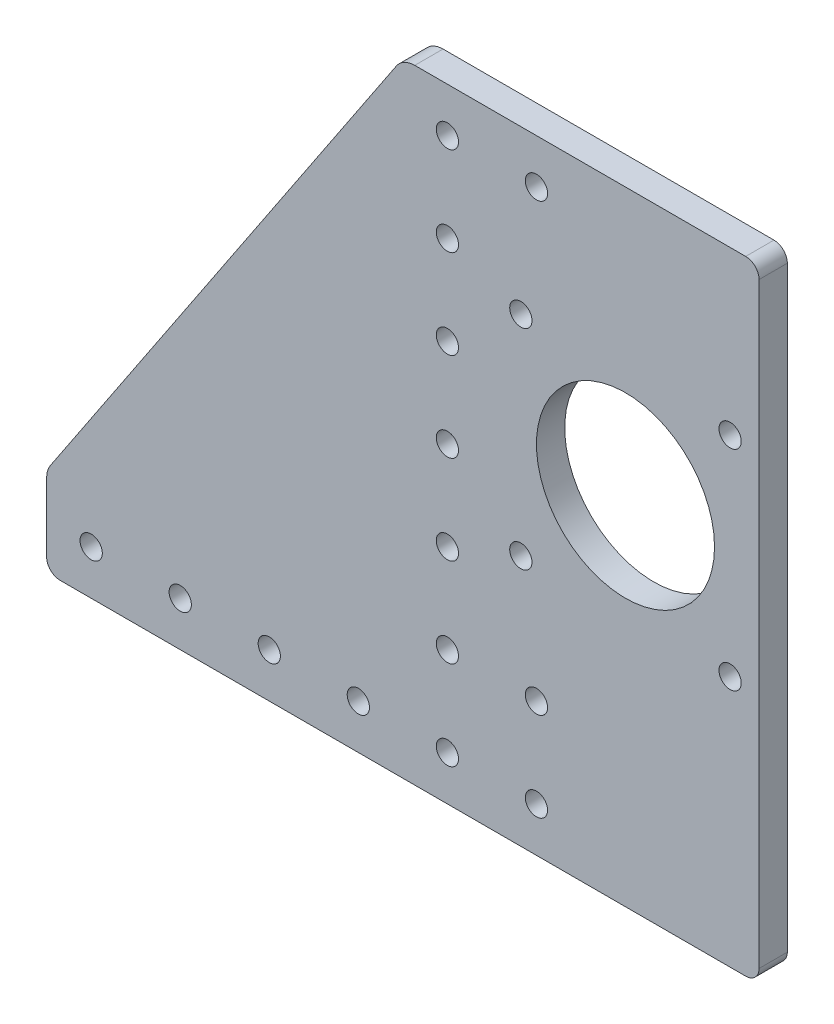
ISO-10303-21;
HEADER;
FILE_DESCRIPTION(('STEP AP214'),'2;1');
FILE_NAME('part.step','',(''),(''),'','','');
FILE_SCHEMA(('AUTOMOTIVE_DESIGN { 1 0 10303 214 1 1 1 1 }'));
ENDSEC;
DATA;
#1=APPLICATION_CONTEXT('core data for automotive mechanical design processes');
#2=APPLICATION_PROTOCOL_DEFINITION('international standard','automotive_design',2000,#1);
#3=PRODUCT_CONTEXT('',#1,'mechanical');
#4=PRODUCT('Part','Part','',(#3));
#5=PRODUCT_RELATED_PRODUCT_CATEGORY('part','',(#4));
#6=PRODUCT_DEFINITION_FORMATION('','',#4);
#7=PRODUCT_DEFINITION_CONTEXT('part definition',#1,'design');
#8=PRODUCT_DEFINITION('design','',#6,#7);
#9=PRODUCT_DEFINITION_SHAPE('','',#8);
#10=(LENGTH_UNIT() NAMED_UNIT(*) SI_UNIT(.MILLI.,.METRE.));
#11=(NAMED_UNIT(*) PLANE_ANGLE_UNIT() SI_UNIT($,.RADIAN.));
#12=(NAMED_UNIT(*) SI_UNIT($,.STERADIAN.) SOLID_ANGLE_UNIT());
#13=UNCERTAINTY_MEASURE_WITH_UNIT(LENGTH_MEASURE(1.E-05),#10,'distance_accuracy_value','');
#14=(GEOMETRIC_REPRESENTATION_CONTEXT(3) GLOBAL_UNCERTAINTY_ASSIGNED_CONTEXT((#13)) GLOBAL_UNIT_ASSIGNED_CONTEXT((#10,
#11,#12)) REPRESENTATION_CONTEXT('',''));
#15=CARTESIAN_POINT('',(0.,0.,0.));
#16=DIRECTION('',(0.,0.,1.));
#17=DIRECTION('',(1.,0.,0.));
#18=AXIS2_PLACEMENT_3D('',#15,#16,#17);
#19=CARTESIAN_POINT('',(0.,0.,6.35));
#20=DIRECTION('',(0.,0.,1.));
#21=DIRECTION('',(1.,0.,0.));
#22=AXIS2_PLACEMENT_3D('',#19,#20,#21);
#23=PLANE('',#22);
#24=CARTESIAN_POINT('',(13.5000000000004,-21.6751824817509,6.35));
#25=DIRECTION('',(0.,0.,1.));
#26=DIRECTION('',(1.,0.,0.));
#27=AXIS2_PLACEMENT_3D('',#24,#25,#26);
#28=CIRCLE('',#27,2.5);
#29=CARTESIAN_POINT('',(16.0000000000004,-21.6751824817509,6.35));
#30=VERTEX_POINT('',#29);
#31=EDGE_CURVE('E294',#30,#30,#28,.T.);
#32=ORIENTED_EDGE('',*,*,#31,.F.);
#33=EDGE_LOOP('',(#32));
#34=FACE_BOUND('',#33,.T.);
#35=CARTESIAN_POINT('',(-33.4999999999998,25.3248175182483,6.35));
#36=DIRECTION('',(0.,0.,1.));
#37=DIRECTION('',(1.,0.,0.));
#38=AXIS2_PLACEMENT_3D('',#35,#36,#37);
#39=CIRCLE('',#38,2.5);
#40=CARTESIAN_POINT('',(-30.9999999999998,25.3248175182483,6.35));
#41=VERTEX_POINT('',#40);
#42=EDGE_CURVE('E282',#41,#41,#39,.T.);
#43=ORIENTED_EDGE('',*,*,#42,.F.);
#44=EDGE_LOOP('',(#43));
#45=FACE_BOUND('',#44,.T.);
#46=CARTESIAN_POINT('',(-110.,-68.1751824817524,6.35));
#47=DIRECTION('',(0.,0.,1.));
#48=DIRECTION('',(1.,0.,0.));
#49=AXIS2_PLACEMENT_3D('',#46,#47,#48);
#50=CIRCLE('',#49,2.50000000000001);
#51=CARTESIAN_POINT('',(-107.5,-68.1751824817524,6.35));
#52=VERTEX_POINT('',#51);
#53=EDGE_CURVE('E270',#52,#52,#50,.T.);
#54=ORIENTED_EDGE('',*,*,#53,.F.);
#55=EDGE_LOOP('',(#54));
#56=FACE_BOUND('',#55,.T.);
#57=CARTESIAN_POINT('',(-70.,-68.1751824817521,6.35));
#58=DIRECTION('',(0.,0.,1.));
#59=DIRECTION('',(1.,0.,0.));
#60=AXIS2_PLACEMENT_3D('',#57,#58,#59);
#61=CIRCLE('',#60,2.50000000000002);
#62=CARTESIAN_POINT('',(-67.5,-68.1751824817521,6.35));
#63=VERTEX_POINT('',#62);
#64=EDGE_CURVE('E258',#63,#63,#61,.T.);
#65=ORIENTED_EDGE('',*,*,#64,.F.);
#66=EDGE_LOOP('',(#65));
#67=FACE_BOUND('',#66,.T.);
#68=CARTESIAN_POINT('',(-30.,-68.1751824817518,6.35));
#69=DIRECTION('',(0.,0.,1.));
#70=DIRECTION('',(1.,0.,0.));
#71=AXIS2_PLACEMENT_3D('',#68,#69,#70);
#72=CIRCLE('',#71,2.50000000000001);
#73=CARTESIAN_POINT('',(-27.5,-68.1751824817518,6.35));
#74=VERTEX_POINT('',#73);
#75=EDGE_CURVE('E246',#74,#74,#72,.T.);
#76=ORIENTED_EDGE('',*,*,#75,.F.);
#77=EDGE_LOOP('',(#76));
#78=FACE_BOUND('',#77,.T.);
#79=CARTESIAN_POINT('',(-30.0000000000003,51.8248175182482,6.35));
#80=DIRECTION('',(0.,0.,1.));
#81=DIRECTION('',(1.,0.,0.));
#82=AXIS2_PLACEMENT_3D('',#79,#80,#81);
#83=CIRCLE('',#82,2.5);
#84=CARTESIAN_POINT('',(-27.5000000000003,51.8248175182482,6.35));
#85=VERTEX_POINT('',#84);
#86=EDGE_CURVE('E234',#85,#85,#83,.T.);
#87=ORIENTED_EDGE('',*,*,#86,.F.);
#88=EDGE_LOOP('',(#87));
#89=FACE_BOUND('',#88,.T.);
#90=CARTESIAN_POINT('',(-50.0000000000003,51.8248175182482,6.35));
#91=DIRECTION('',(0.,0.,1.));
#92=DIRECTION('',(1.,0.,0.));
#93=AXIS2_PLACEMENT_3D('',#90,#91,#92);
#94=CIRCLE('',#93,2.5);
#95=CARTESIAN_POINT('',(-47.5000000000003,51.8248175182482,6.35));
#96=VERTEX_POINT('',#95);
#97=EDGE_CURVE('E222',#96,#96,#94,.T.);
#98=ORIENTED_EDGE('',*,*,#97,.F.);
#99=EDGE_LOOP('',(#98));
#100=FACE_BOUND('',#99,.T.);
#101=CARTESIAN_POINT('',(-50.0000000000002,11.8248175182482,6.35));
#102=DIRECTION('',(0.,0.,1.));
#103=DIRECTION('',(1.,0.,0.));
#104=AXIS2_PLACEMENT_3D('',#101,#102,#103);
#105=CIRCLE('',#104,2.5);
#106=CARTESIAN_POINT('',(-47.5000000000002,11.8248175182482,6.35));
#107=VERTEX_POINT('',#106);
#108=EDGE_CURVE('E210',#107,#107,#105,.T.);
#109=ORIENTED_EDGE('',*,*,#108,.F.);
#110=EDGE_LOOP('',(#109));
#111=FACE_BOUND('',#110,.T.);
#112=CARTESIAN_POINT('',(-50.,-28.1751824817518,6.35));
#113=DIRECTION('',(0.,0.,1.));
#114=DIRECTION('',(1.,0.,0.));
#115=AXIS2_PLACEMENT_3D('',#112,#113,#114);
#116=CIRCLE('',#115,2.5);
#117=CARTESIAN_POINT('',(-47.5,-28.1751824817518,6.35));
#118=VERTEX_POINT('',#117);
#119=EDGE_CURVE('E198',#118,#118,#116,.T.);
#120=ORIENTED_EDGE('',*,*,#119,.F.);
#121=EDGE_LOOP('',(#120));
#122=FACE_BOUND('',#121,.T.);
#123=DIRECTION('',(1.,0.,0.));
#124=VECTOR('',#123,1.);
#125=CARTESIAN_POINT('',(-140.,-78.1751824817518,6.35));
#126=LINE('',#125,#124);
#127=CARTESIAN_POINT('',(-137.,-78.1751824817518,6.35));
#128=VERTEX_POINT('',#127);
#129=CARTESIAN_POINT('',(17.,-78.1751824817518,6.35));
#130=VERTEX_POINT('',#129);
#131=EDGE_CURVE('E126',#128,#130,#126,.T.);
#132=ORIENTED_EDGE('',*,*,#131,.T.);
#133=CARTESIAN_POINT('',(17.,-75.1751824817518,6.35));
#134=DIRECTION('',(0.,0.,1.));
#135=DIRECTION('',(1.,0.,0.));
#136=AXIS2_PLACEMENT_3D('',#133,#134,#135);
#137=CIRCLE('',#136,3.);
#138=CARTESIAN_POINT('',(20.,-75.1751824817518,6.35));
#139=VERTEX_POINT('',#138);
#140=EDGE_CURVE('E173',#130,#139,#137,.T.);
#141=ORIENTED_EDGE('',*,*,#140,.T.);
#142=DIRECTION('',(0.,1.,0.));
#143=VECTOR('',#142,1.);
#144=CARTESIAN_POINT('',(20.,-78.1751824817518,6.35));
#145=LINE('',#144,#143);
#146=CARTESIAN_POINT('',(20.,58.8248175182482,6.35));
#147=VERTEX_POINT('',#146);
#148=EDGE_CURVE('E137',#139,#147,#145,.T.);
#149=ORIENTED_EDGE('',*,*,#148,.T.);
#150=CARTESIAN_POINT('',(17.,58.8248175182482,6.35));
#151=DIRECTION('',(0.,0.,1.));
#152=DIRECTION('',(1.,0.,0.));
#153=AXIS2_PLACEMENT_3D('',#150,#151,#152);
#154=CIRCLE('',#153,3.);
#155=CARTESIAN_POINT('',(17.,61.8248175182482,6.35));
#156=VERTEX_POINT('',#155);
#157=EDGE_CURVE('E47',#147,#156,#154,.T.);
#158=ORIENTED_EDGE('',*,*,#157,.T.);
#159=DIRECTION('',(-1.,0.,0.));
#160=VECTOR('',#159,1.);
#161=CARTESIAN_POINT('',(20.,61.8248175182482,6.35));
#162=LINE('',#161,#160);
#163=CARTESIAN_POINT('',(-57.32408120756,61.8248175182482,6.35));
#164=VERTEX_POINT('',#163);
#165=EDGE_CURVE('E179',#156,#164,#162,.T.);
#166=ORIENTED_EDGE('',*,*,#165,.T.);
#167=CARTESIAN_POINT('',(-57.32408120756,56.8248175182482,6.35));
#168=DIRECTION('',(0.,0.,1.));
#169=DIRECTION('',(1.,0.,0.));
#170=AXIS2_PLACEMENT_3D('',#167,#168,#169);
#171=CIRCLE('',#170,5.);
#172=CARTESIAN_POINT('',(-61.4843326792492,59.5983184993743,6.35));
#173=VERTEX_POINT('',#172);
#174=EDGE_CURVE('E148',#164,#173,#171,.T.);
#175=ORIENTED_EDGE('',*,*,#174,.T.);
#176=DIRECTION('',(-0.554700196225227,-0.832050294337845,0.));
#177=VECTOR('',#176,1.);
#178=CARTESIAN_POINT('',(-140.,-58.1751824817518,6.35));
#179=LINE('',#178,#177);
#180=CARTESIAN_POINT('',(-139.160251471689,-56.9155596892856,6.35));
#181=VERTEX_POINT('',#180);
#182=EDGE_CURVE('E190',#173,#181,#179,.T.);
#183=ORIENTED_EDGE('',*,*,#182,.T.);
#184=CARTESIAN_POINT('',(-135.,-59.6890606704118,6.35));
#185=DIRECTION('',(0.,0.,1.));
#186=DIRECTION('',(1.,0.,0.));
#187=AXIS2_PLACEMENT_3D('',#184,#185,#186);
#188=CIRCLE('',#187,5.);
#189=CARTESIAN_POINT('',(-140.,-59.6890606704118,6.35));
#190=VERTEX_POINT('',#189);
#191=EDGE_CURVE('E150',#181,#190,#188,.T.);
#192=ORIENTED_EDGE('',*,*,#191,.T.);
#193=DIRECTION('',(0.,-1.,0.));
#194=VECTOR('',#193,1.);
#195=CARTESIAN_POINT('',(-140.,-78.1751824817518,6.35));
#196=LINE('',#195,#194);
#197=CARTESIAN_POINT('',(-140.,-75.1751824817518,6.35));
#198=VERTEX_POINT('',#197);
#199=EDGE_CURVE('E125',#190,#198,#196,.T.);
#200=ORIENTED_EDGE('',*,*,#199,.T.);
#201=CARTESIAN_POINT('',(-137.,-75.1751824817518,6.35));
#202=DIRECTION('',(0.,0.,1.));
#203=DIRECTION('',(1.,0.,0.));
#204=AXIS2_PLACEMENT_3D('',#201,#202,#203);
#205=CIRCLE('',#204,3.);
#206=EDGE_CURVE('E170',#198,#128,#205,.T.);
#207=ORIENTED_EDGE('',*,*,#206,.T.);
#208=EDGE_LOOP('',(#132,#141,#149,#158,#166,#175,#183,#192,#200,#207));
#209=FACE_BOUND('',#208,.T.);
#210=CARTESIAN_POINT('',(-50.,-48.1751824817518,6.35));
#211=DIRECTION('',(0.,0.,1.));
#212=DIRECTION('',(1.,0.,0.));
#213=AXIS2_PLACEMENT_3D('',#210,#211,#212);
#214=CIRCLE('',#213,2.5);
#215=CARTESIAN_POINT('',(-47.5,-48.1751824817518,6.35));
#216=VERTEX_POINT('',#215);
#217=EDGE_CURVE('E184',#216,#216,#214,.T.);
#218=ORIENTED_EDGE('',*,*,#217,.F.);
#219=EDGE_LOOP('',(#218));
#220=FACE_BOUND('',#219,.T.);
#221=CARTESIAN_POINT('',(-50.0000000000001,-8.17518248175182,6.35));
#222=DIRECTION('',(0.,0.,1.));
#223=DIRECTION('',(1.,0.,0.));
#224=AXIS2_PLACEMENT_3D('',#221,#222,#223);
#225=CIRCLE('',#224,2.5);
#226=CARTESIAN_POINT('',(-47.5000000000001,-8.17518248175182,6.35));
#227=VERTEX_POINT('',#226);
#228=EDGE_CURVE('E204',#227,#227,#225,.T.);
#229=ORIENTED_EDGE('',*,*,#228,.F.);
#230=EDGE_LOOP('',(#229));
#231=FACE_BOUND('',#230,.T.);
#232=CARTESIAN_POINT('',(-50.0000000000003,31.8248175182482,6.35));
#233=DIRECTION('',(0.,0.,1.));
#234=DIRECTION('',(1.,0.,0.));
#235=AXIS2_PLACEMENT_3D('',#232,#233,#234);
#236=CIRCLE('',#235,2.5);
#237=CARTESIAN_POINT('',(-47.5000000000002,31.8248175182482,6.35));
#238=VERTEX_POINT('',#237);
#239=EDGE_CURVE('E216',#238,#238,#236,.T.);
#240=ORIENTED_EDGE('',*,*,#239,.F.);
#241=EDGE_LOOP('',(#240));
#242=FACE_BOUND('',#241,.T.);
#243=CARTESIAN_POINT('',(-30.,-48.1751824817518,6.35));
#244=DIRECTION('',(0.,0.,1.));
#245=DIRECTION('',(1.,0.,0.));
#246=AXIS2_PLACEMENT_3D('',#243,#244,#245);
#247=CIRCLE('',#246,2.5);
#248=CARTESIAN_POINT('',(-27.5,-48.1751824817518,6.35));
#249=VERTEX_POINT('',#248);
#250=EDGE_CURVE('E228',#249,#249,#247,.T.);
#251=ORIENTED_EDGE('',*,*,#250,.F.);
#252=EDGE_LOOP('',(#251));
#253=FACE_BOUND('',#252,.T.);
#254=CARTESIAN_POINT('',(-9.99999999999993,1.82481751824846,6.35));
#255=DIRECTION('',(0.,0.,1.));
#256=DIRECTION('',(1.,0.,0.));
#257=AXIS2_PLACEMENT_3D('',#254,#255,#256);
#258=CIRCLE('',#257,20.);
#259=CARTESIAN_POINT('',(10.0000000000001,1.82481751824846,6.35));
#260=VERTEX_POINT('',#259);
#261=EDGE_CURVE('E240',#260,#260,#258,.T.);
#262=ORIENTED_EDGE('',*,*,#261,.F.);
#263=EDGE_LOOP('',(#262));
#264=FACE_BOUND('',#263,.T.);
#265=CARTESIAN_POINT('',(-50.,-68.1751824817519,6.35));
#266=DIRECTION('',(0.,0.,1.));
#267=DIRECTION('',(1.,0.,0.));
#268=AXIS2_PLACEMENT_3D('',#265,#266,#267);
#269=CIRCLE('',#268,2.50000000000001);
#270=CARTESIAN_POINT('',(-47.5,-68.1751824817519,6.35));
#271=VERTEX_POINT('',#270);
#272=EDGE_CURVE('E252',#271,#271,#269,.T.);
#273=ORIENTED_EDGE('',*,*,#272,.F.);
#274=EDGE_LOOP('',(#273));
#275=FACE_BOUND('',#274,.T.);
#276=CARTESIAN_POINT('',(-90.,-68.1751824817522,6.35));
#277=DIRECTION('',(0.,0.,1.));
#278=DIRECTION('',(1.,0.,0.));
#279=AXIS2_PLACEMENT_3D('',#276,#277,#278);
#280=CIRCLE('',#279,2.50000000000001);
#281=CARTESIAN_POINT('',(-87.5,-68.1751824817522,6.35));
#282=VERTEX_POINT('',#281);
#283=EDGE_CURVE('E264',#282,#282,#280,.T.);
#284=ORIENTED_EDGE('',*,*,#283,.F.);
#285=EDGE_LOOP('',(#284));
#286=FACE_BOUND('',#285,.T.);
#287=CARTESIAN_POINT('',(-130.,-68.1751824817525,6.35));
#288=DIRECTION('',(0.,0.,1.));
#289=DIRECTION('',(1.,0.,0.));
#290=AXIS2_PLACEMENT_3D('',#287,#288,#289);
#291=CIRCLE('',#290,2.5);
#292=CARTESIAN_POINT('',(-127.5,-68.1751824817525,6.35));
#293=VERTEX_POINT('',#292);
#294=EDGE_CURVE('E276',#293,#293,#291,.T.);
#295=ORIENTED_EDGE('',*,*,#294,.F.);
#296=EDGE_LOOP('',(#295));
#297=FACE_BOUND('',#296,.T.);
#298=CARTESIAN_POINT('',(13.5,25.3248175182489,6.35));
#299=DIRECTION('',(0.,0.,1.));
#300=DIRECTION('',(1.,0.,0.));
#301=AXIS2_PLACEMENT_3D('',#298,#299,#300);
#302=CIRCLE('',#301,2.5);
#303=CARTESIAN_POINT('',(16.,25.3248175182489,6.35));
#304=VERTEX_POINT('',#303);
#305=EDGE_CURVE('E288',#304,#304,#302,.T.);
#306=ORIENTED_EDGE('',*,*,#305,.F.);
#307=EDGE_LOOP('',(#306));
#308=FACE_BOUND('',#307,.T.);
#309=CARTESIAN_POINT('',(-33.4999999999994,-21.6751824817511,6.35));
#310=DIRECTION('',(0.,0.,1.));
#311=DIRECTION('',(1.,0.,0.));
#312=AXIS2_PLACEMENT_3D('',#309,#310,#311);
#313=CIRCLE('',#312,2.5);
#314=CARTESIAN_POINT('',(-30.9999999999994,-21.6751824817511,6.35));
#315=VERTEX_POINT('',#314);
#316=EDGE_CURVE('E300',#315,#315,#313,.T.);
#317=ORIENTED_EDGE('',*,*,#316,.F.);
#318=EDGE_LOOP('',(#317));
#319=FACE_BOUND('',#318,.T.);
#320=ADVANCED_FACE('F32',(#34,#45,#56,#67,#78,#89,#100,#111,#122,#209,#220,#231,#242,#253,#264,
#275,#286,#297,#308,#319),#23,.T.);
#321=CARTESIAN_POINT('',(0.,0.,0.));
#322=DIRECTION('',(0.,0.,1.));
#323=DIRECTION('',(1.,0.,0.));
#324=AXIS2_PLACEMENT_3D('',#321,#322,#323);
#325=PLANE('',#324);
#326=DIRECTION('',(0.,1.,0.));
#327=VECTOR('',#326,1.);
#328=CARTESIAN_POINT('',(20.,-78.1751824817518,0.));
#329=LINE('',#328,#327);
#330=CARTESIAN_POINT('',(20.,-75.1751824817518,0.));
#331=VERTEX_POINT('',#330);
#332=CARTESIAN_POINT('',(20.,58.8248175182482,0.));
#333=VERTEX_POINT('',#332);
#334=EDGE_CURVE('E183',#331,#333,#329,.T.);
#335=ORIENTED_EDGE('',*,*,#334,.F.);
#336=CARTESIAN_POINT('',(17.,-75.1751824817518,0.));
#337=DIRECTION('',(0.,0.,1.));
#338=DIRECTION('',(1.,0.,0.));
#339=AXIS2_PLACEMENT_3D('',#336,#337,#338);
#340=CIRCLE('',#339,3.);
#341=CARTESIAN_POINT('',(17.,-78.1751824817518,0.));
#342=VERTEX_POINT('',#341);
#343=EDGE_CURVE('E163',#331,#342,#340,.F.);
#344=ORIENTED_EDGE('',*,*,#343,.T.);
#345=DIRECTION('',(1.,0.,0.));
#346=VECTOR('',#345,1.);
#347=CARTESIAN_POINT('',(-140.,-78.1751824817518,0.));
#348=LINE('',#347,#346);
#349=CARTESIAN_POINT('',(-137.,-78.1751824817518,0.));
#350=VERTEX_POINT('',#349);
#351=EDGE_CURVE('E133',#350,#342,#348,.T.);
#352=ORIENTED_EDGE('',*,*,#351,.F.);
#353=CARTESIAN_POINT('',(-137.,-75.1751824817518,0.));
#354=DIRECTION('',(0.,0.,1.));
#355=DIRECTION('',(1.,0.,0.));
#356=AXIS2_PLACEMENT_3D('',#353,#354,#355);
#357=CIRCLE('',#356,3.);
#358=CARTESIAN_POINT('',(-140.,-75.1751824817518,0.));
#359=VERTEX_POINT('',#358);
#360=EDGE_CURVE('E132',#350,#359,#357,.F.);
#361=ORIENTED_EDGE('',*,*,#360,.T.);
#362=DIRECTION('',(0.,-1.,0.));
#363=VECTOR('',#362,1.);
#364=CARTESIAN_POINT('',(-140.,-78.1751824817518,0.));
#365=LINE('',#364,#363);
#366=CARTESIAN_POINT('',(-140.,-59.6890606704118,0.));
#367=VERTEX_POINT('',#366);
#368=EDGE_CURVE('E124',#367,#359,#365,.T.);
#369=ORIENTED_EDGE('',*,*,#368,.F.);
#370=CARTESIAN_POINT('',(-135.,-59.6890606704118,0.));
#371=DIRECTION('',(0.,0.,1.));
#372=DIRECTION('',(1.,0.,0.));
#373=AXIS2_PLACEMENT_3D('',#370,#371,#372);
#374=CIRCLE('',#373,5.);
#375=CARTESIAN_POINT('',(-139.160251471689,-56.9155596892856,0.));
#376=VERTEX_POINT('',#375);
#377=EDGE_CURVE('E110',#367,#376,#374,.F.);
#378=ORIENTED_EDGE('',*,*,#377,.T.);
#379=DIRECTION('',(-0.554700196225227,-0.832050294337845,0.));
#380=VECTOR('',#379,1.);
#381=CARTESIAN_POINT('',(-140.,-58.1751824817518,0.));
#382=LINE('',#381,#380);
#383=CARTESIAN_POINT('',(-61.4843326792492,59.5983184993743,0.));
#384=VERTEX_POINT('',#383);
#385=EDGE_CURVE('E134',#384,#376,#382,.T.);
#386=ORIENTED_EDGE('',*,*,#385,.F.);
#387=CARTESIAN_POINT('',(-57.32408120756,56.8248175182482,0.));
#388=DIRECTION('',(0.,0.,1.));
#389=DIRECTION('',(1.,0.,0.));
#390=AXIS2_PLACEMENT_3D('',#387,#388,#389);
#391=CIRCLE('',#390,5.);
#392=CARTESIAN_POINT('',(-57.32408120756,61.8248175182482,0.));
#393=VERTEX_POINT('',#392);
#394=EDGE_CURVE('E121',#384,#393,#391,.F.);
#395=ORIENTED_EDGE('',*,*,#394,.T.);
#396=DIRECTION('',(-1.,0.,0.));
#397=VECTOR('',#396,1.);
#398=CARTESIAN_POINT('',(20.,61.8248175182482,0.));
#399=LINE('',#398,#397);
#400=CARTESIAN_POINT('',(17.,61.8248175182482,0.));
#401=VERTEX_POINT('',#400);
#402=EDGE_CURVE('E139',#401,#393,#399,.T.);
#403=ORIENTED_EDGE('',*,*,#402,.F.);
#404=CARTESIAN_POINT('',(17.,58.8248175182482,0.));
#405=DIRECTION('',(0.,0.,1.));
#406=DIRECTION('',(1.,0.,0.));
#407=AXIS2_PLACEMENT_3D('',#404,#405,#406);
#408=CIRCLE('',#407,3.);
#409=EDGE_CURVE('E161',#401,#333,#408,.F.);
#410=ORIENTED_EDGE('',*,*,#409,.T.);
#411=EDGE_LOOP('',(#335,#344,#352,#361,#369,#378,#386,#395,#403,#410));
#412=FACE_BOUND('',#411,.T.);
#413=CARTESIAN_POINT('',(-50.,-48.1751824817518,0.));
#414=DIRECTION('',(0.,0.,1.));
#415=DIRECTION('',(1.,0.,0.));
#416=AXIS2_PLACEMENT_3D('',#413,#414,#415);
#417=CIRCLE('',#416,2.5);
#418=CARTESIAN_POINT('',(-47.5,-48.1751824817518,0.));
#419=VERTEX_POINT('',#418);
#420=EDGE_CURVE('E195',#419,#419,#417,.T.);
#421=ORIENTED_EDGE('',*,*,#420,.T.);
#422=EDGE_LOOP('',(#421));
#423=FACE_BOUND('',#422,.T.);
#424=CARTESIAN_POINT('',(-50.,-28.1751824817518,0.));
#425=DIRECTION('',(0.,0.,1.));
#426=DIRECTION('',(1.,0.,0.));
#427=AXIS2_PLACEMENT_3D('',#424,#425,#426);
#428=CIRCLE('',#427,2.5);
#429=CARTESIAN_POINT('',(-47.5,-28.1751824817518,0.));
#430=VERTEX_POINT('',#429);
#431=EDGE_CURVE('E201',#430,#430,#428,.T.);
#432=ORIENTED_EDGE('',*,*,#431,.T.);
#433=EDGE_LOOP('',(#432));
#434=FACE_BOUND('',#433,.T.);
#435=CARTESIAN_POINT('',(-50.0000000000001,-8.17518248175182,0.));
#436=DIRECTION('',(0.,0.,1.));
#437=DIRECTION('',(1.,0.,0.));
#438=AXIS2_PLACEMENT_3D('',#435,#436,#437);
#439=CIRCLE('',#438,2.5);
#440=CARTESIAN_POINT('',(-47.5000000000001,-8.17518248175182,0.));
#441=VERTEX_POINT('',#440);
#442=EDGE_CURVE('E207',#441,#441,#439,.T.);
#443=ORIENTED_EDGE('',*,*,#442,.T.);
#444=EDGE_LOOP('',(#443));
#445=FACE_BOUND('',#444,.T.);
#446=CARTESIAN_POINT('',(-50.0000000000002,11.8248175182482,0.));
#447=DIRECTION('',(0.,0.,1.));
#448=DIRECTION('',(1.,0.,0.));
#449=AXIS2_PLACEMENT_3D('',#446,#447,#448);
#450=CIRCLE('',#449,2.5);
#451=CARTESIAN_POINT('',(-47.5000000000002,11.8248175182482,0.));
#452=VERTEX_POINT('',#451);
#453=EDGE_CURVE('E213',#452,#452,#450,.T.);
#454=ORIENTED_EDGE('',*,*,#453,.T.);
#455=EDGE_LOOP('',(#454));
#456=FACE_BOUND('',#455,.T.);
#457=CARTESIAN_POINT('',(-50.0000000000003,31.8248175182482,0.));
#458=DIRECTION('',(0.,0.,1.));
#459=DIRECTION('',(1.,0.,0.));
#460=AXIS2_PLACEMENT_3D('',#457,#458,#459);
#461=CIRCLE('',#460,2.5);
#462=CARTESIAN_POINT('',(-47.5000000000002,31.8248175182482,0.));
#463=VERTEX_POINT('',#462);
#464=EDGE_CURVE('E219',#463,#463,#461,.T.);
#465=ORIENTED_EDGE('',*,*,#464,.T.);
#466=EDGE_LOOP('',(#465));
#467=FACE_BOUND('',#466,.T.);
#468=CARTESIAN_POINT('',(-50.0000000000003,51.8248175182482,0.));
#469=DIRECTION('',(0.,0.,1.));
#470=DIRECTION('',(1.,0.,0.));
#471=AXIS2_PLACEMENT_3D('',#468,#469,#470);
#472=CIRCLE('',#471,2.5);
#473=CARTESIAN_POINT('',(-47.5000000000003,51.8248175182482,0.));
#474=VERTEX_POINT('',#473);
#475=EDGE_CURVE('E225',#474,#474,#472,.T.);
#476=ORIENTED_EDGE('',*,*,#475,.T.);
#477=EDGE_LOOP('',(#476));
#478=FACE_BOUND('',#477,.T.);
#479=CARTESIAN_POINT('',(-30.,-48.1751824817518,0.));
#480=DIRECTION('',(0.,0.,1.));
#481=DIRECTION('',(1.,0.,0.));
#482=AXIS2_PLACEMENT_3D('',#479,#480,#481);
#483=CIRCLE('',#482,2.5);
#484=CARTESIAN_POINT('',(-27.5,-48.1751824817518,0.));
#485=VERTEX_POINT('',#484);
#486=EDGE_CURVE('E231',#485,#485,#483,.T.);
#487=ORIENTED_EDGE('',*,*,#486,.T.);
#488=EDGE_LOOP('',(#487));
#489=FACE_BOUND('',#488,.T.);
#490=CARTESIAN_POINT('',(-30.0000000000003,51.8248175182482,0.));
#491=DIRECTION('',(0.,0.,1.));
#492=DIRECTION('',(1.,0.,0.));
#493=AXIS2_PLACEMENT_3D('',#490,#491,#492);
#494=CIRCLE('',#493,2.5);
#495=CARTESIAN_POINT('',(-27.5000000000003,51.8248175182482,0.));
#496=VERTEX_POINT('',#495);
#497=EDGE_CURVE('E237',#496,#496,#494,.T.);
#498=ORIENTED_EDGE('',*,*,#497,.T.);
#499=EDGE_LOOP('',(#498));
#500=FACE_BOUND('',#499,.T.);
#501=CARTESIAN_POINT('',(-9.99999999999993,1.82481751824846,0.));
#502=DIRECTION('',(0.,0.,1.));
#503=DIRECTION('',(1.,0.,0.));
#504=AXIS2_PLACEMENT_3D('',#501,#502,#503);
#505=CIRCLE('',#504,20.);
#506=CARTESIAN_POINT('',(10.0000000000001,1.82481751824846,0.));
#507=VERTEX_POINT('',#506);
#508=EDGE_CURVE('E243',#507,#507,#505,.T.);
#509=ORIENTED_EDGE('',*,*,#508,.T.);
#510=EDGE_LOOP('',(#509));
#511=FACE_BOUND('',#510,.T.);
#512=CARTESIAN_POINT('',(-30.,-68.1751824817518,0.));
#513=DIRECTION('',(0.,0.,1.));
#514=DIRECTION('',(1.,0.,0.));
#515=AXIS2_PLACEMENT_3D('',#512,#513,#514);
#516=CIRCLE('',#515,2.50000000000001);
#517=CARTESIAN_POINT('',(-27.5,-68.1751824817518,0.));
#518=VERTEX_POINT('',#517);
#519=EDGE_CURVE('E249',#518,#518,#516,.T.);
#520=ORIENTED_EDGE('',*,*,#519,.T.);
#521=EDGE_LOOP('',(#520));
#522=FACE_BOUND('',#521,.T.);
#523=CARTESIAN_POINT('',(-50.,-68.1751824817519,0.));
#524=DIRECTION('',(0.,0.,1.));
#525=DIRECTION('',(1.,0.,0.));
#526=AXIS2_PLACEMENT_3D('',#523,#524,#525);
#527=CIRCLE('',#526,2.50000000000001);
#528=CARTESIAN_POINT('',(-47.5,-68.1751824817519,0.));
#529=VERTEX_POINT('',#528);
#530=EDGE_CURVE('E255',#529,#529,#527,.T.);
#531=ORIENTED_EDGE('',*,*,#530,.T.);
#532=EDGE_LOOP('',(#531));
#533=FACE_BOUND('',#532,.T.);
#534=CARTESIAN_POINT('',(-70.,-68.1751824817521,0.));
#535=DIRECTION('',(0.,0.,1.));
#536=DIRECTION('',(1.,0.,0.));
#537=AXIS2_PLACEMENT_3D('',#534,#535,#536);
#538=CIRCLE('',#537,2.50000000000002);
#539=CARTESIAN_POINT('',(-67.5,-68.1751824817521,0.));
#540=VERTEX_POINT('',#539);
#541=EDGE_CURVE('E261',#540,#540,#538,.T.);
#542=ORIENTED_EDGE('',*,*,#541,.T.);
#543=EDGE_LOOP('',(#542));
#544=FACE_BOUND('',#543,.T.);
#545=CARTESIAN_POINT('',(-90.,-68.1751824817522,0.));
#546=DIRECTION('',(0.,0.,1.));
#547=DIRECTION('',(1.,0.,0.));
#548=AXIS2_PLACEMENT_3D('',#545,#546,#547);
#549=CIRCLE('',#548,2.50000000000001);
#550=CARTESIAN_POINT('',(-87.5,-68.1751824817522,0.));
#551=VERTEX_POINT('',#550);
#552=EDGE_CURVE('E267',#551,#551,#549,.T.);
#553=ORIENTED_EDGE('',*,*,#552,.T.);
#554=EDGE_LOOP('',(#553));
#555=FACE_BOUND('',#554,.T.);
#556=CARTESIAN_POINT('',(-110.,-68.1751824817524,0.));
#557=DIRECTION('',(0.,0.,1.));
#558=DIRECTION('',(1.,0.,0.));
#559=AXIS2_PLACEMENT_3D('',#556,#557,#558);
#560=CIRCLE('',#559,2.50000000000001);
#561=CARTESIAN_POINT('',(-107.5,-68.1751824817524,0.));
#562=VERTEX_POINT('',#561);
#563=EDGE_CURVE('E273',#562,#562,#560,.T.);
#564=ORIENTED_EDGE('',*,*,#563,.T.);
#565=EDGE_LOOP('',(#564));
#566=FACE_BOUND('',#565,.T.);
#567=CARTESIAN_POINT('',(-130.,-68.1751824817525,0.));
#568=DIRECTION('',(0.,0.,1.));
#569=DIRECTION('',(1.,0.,0.));
#570=AXIS2_PLACEMENT_3D('',#567,#568,#569);
#571=CIRCLE('',#570,2.5);
#572=CARTESIAN_POINT('',(-127.5,-68.1751824817525,0.));
#573=VERTEX_POINT('',#572);
#574=EDGE_CURVE('E279',#573,#573,#571,.T.);
#575=ORIENTED_EDGE('',*,*,#574,.T.);
#576=EDGE_LOOP('',(#575));
#577=FACE_BOUND('',#576,.T.);
#578=CARTESIAN_POINT('',(-33.4999999999998,25.3248175182483,0.));
#579=DIRECTION('',(0.,0.,1.));
#580=DIRECTION('',(1.,0.,0.));
#581=AXIS2_PLACEMENT_3D('',#578,#579,#580);
#582=CIRCLE('',#581,2.5);
#583=CARTESIAN_POINT('',(-30.9999999999998,25.3248175182483,0.));
#584=VERTEX_POINT('',#583);
#585=EDGE_CURVE('E285',#584,#584,#582,.T.);
#586=ORIENTED_EDGE('',*,*,#585,.T.);
#587=EDGE_LOOP('',(#586));
#588=FACE_BOUND('',#587,.T.);
#589=CARTESIAN_POINT('',(13.5,25.3248175182489,0.));
#590=DIRECTION('',(0.,0.,1.));
#591=DIRECTION('',(1.,0.,0.));
#592=AXIS2_PLACEMENT_3D('',#589,#590,#591);
#593=CIRCLE('',#592,2.5);
#594=CARTESIAN_POINT('',(16.,25.3248175182489,0.));
#595=VERTEX_POINT('',#594);
#596=EDGE_CURVE('E291',#595,#595,#593,.T.);
#597=ORIENTED_EDGE('',*,*,#596,.T.);
#598=EDGE_LOOP('',(#597));
#599=FACE_BOUND('',#598,.T.);
#600=CARTESIAN_POINT('',(13.5000000000004,-21.6751824817509,0.));
#601=DIRECTION('',(0.,0.,1.));
#602=DIRECTION('',(1.,0.,0.));
#603=AXIS2_PLACEMENT_3D('',#600,#601,#602);
#604=CIRCLE('',#603,2.5);
#605=CARTESIAN_POINT('',(16.0000000000004,-21.6751824817509,0.));
#606=VERTEX_POINT('',#605);
#607=EDGE_CURVE('E297',#606,#606,#604,.T.);
#608=ORIENTED_EDGE('',*,*,#607,.T.);
#609=EDGE_LOOP('',(#608));
#610=FACE_BOUND('',#609,.T.);
#611=CARTESIAN_POINT('',(-33.4999999999994,-21.6751824817511,0.));
#612=DIRECTION('',(0.,0.,1.));
#613=DIRECTION('',(1.,0.,0.));
#614=AXIS2_PLACEMENT_3D('',#611,#612,#613);
#615=CIRCLE('',#614,2.5);
#616=CARTESIAN_POINT('',(-30.9999999999994,-21.6751824817511,0.));
#617=VERTEX_POINT('',#616);
#618=EDGE_CURVE('E303',#617,#617,#615,.T.);
#619=ORIENTED_EDGE('',*,*,#618,.T.);
#620=EDGE_LOOP('',(#619));
#621=FACE_BOUND('',#620,.T.);
#622=ADVANCED_FACE('F129',(#412,#423,#434,#445,#456,#467,#478,#489,#500,#511,#522,#533,#544,
#555,#566,#577,#588,#599,#610,#621),#325,.F.);
#623=CARTESIAN_POINT('',(20.,-78.1751824817518,6.35));
#624=DIRECTION('',(-1.,0.,0.));
#625=DIRECTION('',(0.,0.,1.));
#626=AXIS2_PLACEMENT_3D('',#623,#624,#625);
#627=PLANE('',#626);
#628=ORIENTED_EDGE('',*,*,#148,.F.);
#629=DIRECTION('',(0.,0.,-1.));
#630=VECTOR('',#629,1.);
#631=CARTESIAN_POINT('',(20.,-75.1751824817518,6.35));
#632=LINE('',#631,#630);
#633=EDGE_CURVE('E157',#139,#331,#632,.T.);
#634=ORIENTED_EDGE('',*,*,#633,.T.);
#635=ORIENTED_EDGE('',*,*,#334,.T.);
#636=DIRECTION('',(0.,0.,-1.));
#637=VECTOR('',#636,1.);
#638=CARTESIAN_POINT('',(20.,58.8248175182482,6.35));
#639=LINE('',#638,#637);
#640=EDGE_CURVE('E155',#333,#147,#639,.F.);
#641=ORIENTED_EDGE('',*,*,#640,.T.);
#642=EDGE_LOOP('',(#628,#634,#635,#641));
#643=FACE_BOUND('',#642,.T.);
#644=ADVANCED_FACE('F318',(#643),#627,.F.);
#645=CARTESIAN_POINT('',(20.,61.8248175182482,6.35));
#646=DIRECTION('',(0.,-1.,0.));
#647=DIRECTION('',(1.,0.,0.));
#648=AXIS2_PLACEMENT_3D('',#645,#646,#647);
#649=PLANE('',#648);
#650=ORIENTED_EDGE('',*,*,#165,.F.);
#651=DIRECTION('',(0.,0.,-1.));
#652=VECTOR('',#651,1.);
#653=CARTESIAN_POINT('',(17.,61.8248175182482,6.35));
#654=LINE('',#653,#652);
#655=EDGE_CURVE('E40',#156,#401,#654,.T.);
#656=ORIENTED_EDGE('',*,*,#655,.T.);
#657=ORIENTED_EDGE('',*,*,#402,.T.);
#658=DIRECTION('',(0.,0.,-1.));
#659=VECTOR('',#658,1.);
#660=CARTESIAN_POINT('',(-57.32408120756,61.8248175182482,6.35));
#661=LINE('',#660,#659);
#662=EDGE_CURVE('E152',#393,#164,#661,.F.);
#663=ORIENTED_EDGE('',*,*,#662,.T.);
#664=EDGE_LOOP('',(#650,#656,#657,#663));
#665=FACE_BOUND('',#664,.T.);
#666=ADVANCED_FACE('F178',(#665),#649,.F.);
#667=CARTESIAN_POINT('',(-140.,-58.1751824817518,6.35));
#668=DIRECTION('',(0.832050294337845,-0.554700196225227,0.));
#669=DIRECTION('',(0.554700196225227,0.832050294337845,0.));
#670=AXIS2_PLACEMENT_3D('',#667,#668,#669);
#671=PLANE('',#670);
#672=ORIENTED_EDGE('',*,*,#385,.T.);
#673=DIRECTION('',(0.,0.,-1.));
#674=VECTOR('',#673,1.);
#675=CARTESIAN_POINT('',(-139.160251471689,-56.9155596892856,6.35));
#676=LINE('',#675,#674);
#677=EDGE_CURVE('E115',#376,#181,#676,.F.);
#678=ORIENTED_EDGE('',*,*,#677,.T.);
#679=ORIENTED_EDGE('',*,*,#182,.F.);
#680=DIRECTION('',(0.,0.,-1.));
#681=VECTOR('',#680,1.);
#682=CARTESIAN_POINT('',(-61.4843326792492,59.5983184993743,6.35));
#683=LINE('',#682,#681);
#684=EDGE_CURVE('E120',#173,#384,#683,.T.);
#685=ORIENTED_EDGE('',*,*,#684,.T.);
#686=EDGE_LOOP('',(#672,#678,#679,#685));
#687=FACE_BOUND('',#686,.T.);
#688=ADVANCED_FACE('F332',(#687),#671,.F.);
#689=CARTESIAN_POINT('',(-140.,-78.1751824817518,6.35));
#690=DIRECTION('',(1.,0.,0.));
#691=DIRECTION('',(0.,0.,-1.));
#692=AXIS2_PLACEMENT_3D('',#689,#690,#691);
#693=PLANE('',#692);
#694=ORIENTED_EDGE('',*,*,#368,.T.);
#695=DIRECTION('',(0.,0.,-1.));
#696=VECTOR('',#695,1.);
#697=CARTESIAN_POINT('',(-140.,-75.1751824817518,6.35));
#698=LINE('',#697,#696);
#699=EDGE_CURVE('E11',#359,#198,#698,.F.);
#700=ORIENTED_EDGE('',*,*,#699,.T.);
#701=ORIENTED_EDGE('',*,*,#199,.F.);
#702=DIRECTION('',(0.,0.,-1.));
#703=VECTOR('',#702,1.);
#704=CARTESIAN_POINT('',(-140.,-59.6890606704118,6.35));
#705=LINE('',#704,#703);
#706=EDGE_CURVE('E114',#190,#367,#705,.T.);
#707=ORIENTED_EDGE('',*,*,#706,.T.);
#708=EDGE_LOOP('',(#694,#700,#701,#707));
#709=FACE_BOUND('',#708,.T.);
#710=ADVANCED_FACE('F123',(#709),#693,.F.);
#711=CARTESIAN_POINT('',(-140.,-78.1751824817518,6.35));
#712=DIRECTION('',(0.,1.,0.));
#713=DIRECTION('',(0.,0.,1.));
#714=AXIS2_PLACEMENT_3D('',#711,#712,#713);
#715=PLANE('',#714);
#716=ORIENTED_EDGE('',*,*,#351,.T.);
#717=DIRECTION('',(0.,0.,-1.));
#718=VECTOR('',#717,1.);
#719=CARTESIAN_POINT('',(17.,-78.1751824817518,6.35));
#720=LINE('',#719,#718);
#721=EDGE_CURVE('E168',#342,#130,#720,.F.);
#722=ORIENTED_EDGE('',*,*,#721,.T.);
#723=ORIENTED_EDGE('',*,*,#131,.F.);
#724=DIRECTION('',(0.,0.,-1.));
#725=VECTOR('',#724,1.);
#726=CARTESIAN_POINT('',(-137.,-78.1751824817518,6.35));
#727=LINE('',#726,#725);
#728=EDGE_CURVE('E165',#128,#350,#727,.T.);
#729=ORIENTED_EDGE('',*,*,#728,.T.);
#730=EDGE_LOOP('',(#716,#722,#723,#729));
#731=FACE_BOUND('',#730,.T.);
#732=ADVANCED_FACE('F326',(#731),#715,.F.);
#733=CARTESIAN_POINT('',(-50.,-48.1751824817518,6.35));
#734=DIRECTION('',(0.,0.,-1.));
#735=DIRECTION('',(-1.,0.,0.));
#736=AXIS2_PLACEMENT_3D('',#733,#734,#735);
#737=CYLINDRICAL_SURFACE('',#736,2.5);
#738=ORIENTED_EDGE('',*,*,#217,.T.);
#739=EDGE_LOOP('',(#738));
#740=FACE_BOUND('',#739,.T.);
#741=ORIENTED_EDGE('',*,*,#420,.F.);
#742=EDGE_LOOP('',(#741));
#743=FACE_BOUND('',#742,.T.);
#744=ADVANCED_FACE('F323',(#740,#743),#737,.F.);
#745=CARTESIAN_POINT('',(-50.,-28.1751824817518,6.35));
#746=DIRECTION('',(0.,0.,-1.));
#747=DIRECTION('',(-1.,0.,0.));
#748=AXIS2_PLACEMENT_3D('',#745,#746,#747);
#749=CYLINDRICAL_SURFACE('',#748,2.5);
#750=ORIENTED_EDGE('',*,*,#119,.T.);
#751=EDGE_LOOP('',(#750));
#752=FACE_BOUND('',#751,.T.);
#753=ORIENTED_EDGE('',*,*,#431,.F.);
#754=EDGE_LOOP('',(#753));
#755=FACE_BOUND('',#754,.T.);
#756=ADVANCED_FACE('F459',(#752,#755),#749,.F.);
#757=CARTESIAN_POINT('',(-50.0000000000001,-8.17518248175182,6.35));
#758=DIRECTION('',(0.,0.,-1.));
#759=DIRECTION('',(-1.,0.,0.));
#760=AXIS2_PLACEMENT_3D('',#757,#758,#759);
#761=CYLINDRICAL_SURFACE('',#760,2.5);
#762=ORIENTED_EDGE('',*,*,#228,.T.);
#763=EDGE_LOOP('',(#762));
#764=FACE_BOUND('',#763,.T.);
#765=ORIENTED_EDGE('',*,*,#442,.F.);
#766=EDGE_LOOP('',(#765));
#767=FACE_BOUND('',#766,.T.);
#768=ADVANCED_FACE('F456',(#764,#767),#761,.F.);
#769=CARTESIAN_POINT('',(-50.0000000000002,11.8248175182482,6.35));
#770=DIRECTION('',(0.,0.,-1.));
#771=DIRECTION('',(-1.,0.,0.));
#772=AXIS2_PLACEMENT_3D('',#769,#770,#771);
#773=CYLINDRICAL_SURFACE('',#772,2.5);
#774=ORIENTED_EDGE('',*,*,#108,.T.);
#775=EDGE_LOOP('',(#774));
#776=FACE_BOUND('',#775,.T.);
#777=ORIENTED_EDGE('',*,*,#453,.F.);
#778=EDGE_LOOP('',(#777));
#779=FACE_BOUND('',#778,.T.);
#780=ADVANCED_FACE('F452',(#776,#779),#773,.F.);
#781=CARTESIAN_POINT('',(-50.0000000000003,31.8248175182482,6.35));
#782=DIRECTION('',(0.,0.,-1.));
#783=DIRECTION('',(-1.,0.,0.));
#784=AXIS2_PLACEMENT_3D('',#781,#782,#783);
#785=CYLINDRICAL_SURFACE('',#784,2.5);
#786=ORIENTED_EDGE('',*,*,#239,.T.);
#787=EDGE_LOOP('',(#786));
#788=FACE_BOUND('',#787,.T.);
#789=ORIENTED_EDGE('',*,*,#464,.F.);
#790=EDGE_LOOP('',(#789));
#791=FACE_BOUND('',#790,.T.);
#792=ADVANCED_FACE('F448',(#788,#791),#785,.F.);
#793=CARTESIAN_POINT('',(-50.0000000000003,51.8248175182482,6.35));
#794=DIRECTION('',(0.,0.,-1.));
#795=DIRECTION('',(-1.,0.,0.));
#796=AXIS2_PLACEMENT_3D('',#793,#794,#795);
#797=CYLINDRICAL_SURFACE('',#796,2.5);
#798=ORIENTED_EDGE('',*,*,#97,.T.);
#799=EDGE_LOOP('',(#798));
#800=FACE_BOUND('',#799,.T.);
#801=ORIENTED_EDGE('',*,*,#475,.F.);
#802=EDGE_LOOP('',(#801));
#803=FACE_BOUND('',#802,.T.);
#804=ADVANCED_FACE('F444',(#800,#803),#797,.F.);
#805=CARTESIAN_POINT('',(-30.,-48.1751824817518,6.35));
#806=DIRECTION('',(0.,0.,-1.));
#807=DIRECTION('',(-1.,0.,0.));
#808=AXIS2_PLACEMENT_3D('',#805,#806,#807);
#809=CYLINDRICAL_SURFACE('',#808,2.5);
#810=ORIENTED_EDGE('',*,*,#250,.T.);
#811=EDGE_LOOP('',(#810));
#812=FACE_BOUND('',#811,.T.);
#813=ORIENTED_EDGE('',*,*,#486,.F.);
#814=EDGE_LOOP('',(#813));
#815=FACE_BOUND('',#814,.T.);
#816=ADVANCED_FACE('F440',(#812,#815),#809,.F.);
#817=CARTESIAN_POINT('',(-30.0000000000003,51.8248175182482,6.35));
#818=DIRECTION('',(0.,0.,-1.));
#819=DIRECTION('',(-1.,0.,0.));
#820=AXIS2_PLACEMENT_3D('',#817,#818,#819);
#821=CYLINDRICAL_SURFACE('',#820,2.5);
#822=ORIENTED_EDGE('',*,*,#86,.T.);
#823=EDGE_LOOP('',(#822));
#824=FACE_BOUND('',#823,.T.);
#825=ORIENTED_EDGE('',*,*,#497,.F.);
#826=EDGE_LOOP('',(#825));
#827=FACE_BOUND('',#826,.T.);
#828=ADVANCED_FACE('F436',(#824,#827),#821,.F.);
#829=CARTESIAN_POINT('',(-9.99999999999993,1.82481751824846,6.35));
#830=DIRECTION('',(0.,0.,-1.));
#831=DIRECTION('',(-1.,0.,0.));
#832=AXIS2_PLACEMENT_3D('',#829,#830,#831);
#833=CYLINDRICAL_SURFACE('',#832,20.);
#834=ORIENTED_EDGE('',*,*,#261,.T.);
#835=EDGE_LOOP('',(#834));
#836=FACE_BOUND('',#835,.T.);
#837=ORIENTED_EDGE('',*,*,#508,.F.);
#838=EDGE_LOOP('',(#837));
#839=FACE_BOUND('',#838,.T.);
#840=ADVANCED_FACE('F432',(#836,#839),#833,.F.);
#841=CARTESIAN_POINT('',(-30.,-68.1751824817518,6.35));
#842=DIRECTION('',(0.,0.,-1.));
#843=DIRECTION('',(-1.,0.,0.));
#844=AXIS2_PLACEMENT_3D('',#841,#842,#843);
#845=CYLINDRICAL_SURFACE('',#844,2.50000000000001);
#846=ORIENTED_EDGE('',*,*,#75,.T.);
#847=EDGE_LOOP('',(#846));
#848=FACE_BOUND('',#847,.T.);
#849=ORIENTED_EDGE('',*,*,#519,.F.);
#850=EDGE_LOOP('',(#849));
#851=FACE_BOUND('',#850,.T.);
#852=ADVANCED_FACE('F428',(#848,#851),#845,.F.);
#853=CARTESIAN_POINT('',(-50.,-68.1751824817519,6.35));
#854=DIRECTION('',(0.,0.,-1.));
#855=DIRECTION('',(-1.,0.,0.));
#856=AXIS2_PLACEMENT_3D('',#853,#854,#855);
#857=CYLINDRICAL_SURFACE('',#856,2.50000000000001);
#858=ORIENTED_EDGE('',*,*,#272,.T.);
#859=EDGE_LOOP('',(#858));
#860=FACE_BOUND('',#859,.T.);
#861=ORIENTED_EDGE('',*,*,#530,.F.);
#862=EDGE_LOOP('',(#861));
#863=FACE_BOUND('',#862,.T.);
#864=ADVANCED_FACE('F424',(#860,#863),#857,.F.);
#865=CARTESIAN_POINT('',(-70.,-68.1751824817521,6.35));
#866=DIRECTION('',(0.,0.,-1.));
#867=DIRECTION('',(-1.,0.,0.));
#868=AXIS2_PLACEMENT_3D('',#865,#866,#867);
#869=CYLINDRICAL_SURFACE('',#868,2.50000000000002);
#870=ORIENTED_EDGE('',*,*,#64,.T.);
#871=EDGE_LOOP('',(#870));
#872=FACE_BOUND('',#871,.T.);
#873=ORIENTED_EDGE('',*,*,#541,.F.);
#874=EDGE_LOOP('',(#873));
#875=FACE_BOUND('',#874,.T.);
#876=ADVANCED_FACE('F420',(#872,#875),#869,.F.);
#877=CARTESIAN_POINT('',(-90.,-68.1751824817522,6.35));
#878=DIRECTION('',(0.,0.,-1.));
#879=DIRECTION('',(-1.,0.,0.));
#880=AXIS2_PLACEMENT_3D('',#877,#878,#879);
#881=CYLINDRICAL_SURFACE('',#880,2.50000000000001);
#882=ORIENTED_EDGE('',*,*,#283,.T.);
#883=EDGE_LOOP('',(#882));
#884=FACE_BOUND('',#883,.T.);
#885=ORIENTED_EDGE('',*,*,#552,.F.);
#886=EDGE_LOOP('',(#885));
#887=FACE_BOUND('',#886,.T.);
#888=ADVANCED_FACE('F416',(#884,#887),#881,.F.);
#889=CARTESIAN_POINT('',(-110.,-68.1751824817524,6.35));
#890=DIRECTION('',(0.,0.,-1.));
#891=DIRECTION('',(-1.,0.,0.));
#892=AXIS2_PLACEMENT_3D('',#889,#890,#891);
#893=CYLINDRICAL_SURFACE('',#892,2.50000000000001);
#894=ORIENTED_EDGE('',*,*,#53,.T.);
#895=EDGE_LOOP('',(#894));
#896=FACE_BOUND('',#895,.T.);
#897=ORIENTED_EDGE('',*,*,#563,.F.);
#898=EDGE_LOOP('',(#897));
#899=FACE_BOUND('',#898,.T.);
#900=ADVANCED_FACE('F412',(#896,#899),#893,.F.);
#901=CARTESIAN_POINT('',(-130.,-68.1751824817525,6.35));
#902=DIRECTION('',(0.,0.,-1.));
#903=DIRECTION('',(-1.,0.,0.));
#904=AXIS2_PLACEMENT_3D('',#901,#902,#903);
#905=CYLINDRICAL_SURFACE('',#904,2.5);
#906=ORIENTED_EDGE('',*,*,#294,.T.);
#907=EDGE_LOOP('',(#906));
#908=FACE_BOUND('',#907,.T.);
#909=ORIENTED_EDGE('',*,*,#574,.F.);
#910=EDGE_LOOP('',(#909));
#911=FACE_BOUND('',#910,.T.);
#912=ADVANCED_FACE('F408',(#908,#911),#905,.F.);
#913=CARTESIAN_POINT('',(-33.4999999999998,25.3248175182483,6.35));
#914=DIRECTION('',(0.,0.,-1.));
#915=DIRECTION('',(-1.,0.,0.));
#916=AXIS2_PLACEMENT_3D('',#913,#914,#915);
#917=CYLINDRICAL_SURFACE('',#916,2.5);
#918=ORIENTED_EDGE('',*,*,#42,.T.);
#919=EDGE_LOOP('',(#918));
#920=FACE_BOUND('',#919,.T.);
#921=ORIENTED_EDGE('',*,*,#585,.F.);
#922=EDGE_LOOP('',(#921));
#923=FACE_BOUND('',#922,.T.);
#924=ADVANCED_FACE('F390',(#920,#923),#917,.F.);
#925=CARTESIAN_POINT('',(13.5,25.3248175182489,6.35));
#926=DIRECTION('',(0.,0.,-1.));
#927=DIRECTION('',(-1.,0.,0.));
#928=AXIS2_PLACEMENT_3D('',#925,#926,#927);
#929=CYLINDRICAL_SURFACE('',#928,2.5);
#930=ORIENTED_EDGE('',*,*,#305,.T.);
#931=EDGE_LOOP('',(#930));
#932=FACE_BOUND('',#931,.T.);
#933=ORIENTED_EDGE('',*,*,#596,.F.);
#934=EDGE_LOOP('',(#933));
#935=FACE_BOUND('',#934,.T.);
#936=ADVANCED_FACE('F386',(#932,#935),#929,.F.);
#937=CARTESIAN_POINT('',(13.5000000000004,-21.6751824817509,6.35));
#938=DIRECTION('',(0.,0.,-1.));
#939=DIRECTION('',(-1.,0.,0.));
#940=AXIS2_PLACEMENT_3D('',#937,#938,#939);
#941=CYLINDRICAL_SURFACE('',#940,2.5);
#942=ORIENTED_EDGE('',*,*,#31,.T.);
#943=EDGE_LOOP('',(#942));
#944=FACE_BOUND('',#943,.T.);
#945=ORIENTED_EDGE('',*,*,#607,.F.);
#946=EDGE_LOOP('',(#945));
#947=FACE_BOUND('',#946,.T.);
#948=ADVANCED_FACE('F389',(#944,#947),#941,.F.);
#949=CARTESIAN_POINT('',(-33.4999999999994,-21.6751824817511,6.35));
#950=DIRECTION('',(0.,0.,-1.));
#951=DIRECTION('',(-1.,0.,0.));
#952=AXIS2_PLACEMENT_3D('',#949,#950,#951);
#953=CYLINDRICAL_SURFACE('',#952,2.5);
#954=ORIENTED_EDGE('',*,*,#316,.T.);
#955=EDGE_LOOP('',(#954));
#956=FACE_BOUND('',#955,.T.);
#957=ORIENTED_EDGE('',*,*,#618,.F.);
#958=EDGE_LOOP('',(#957));
#959=FACE_BOUND('',#958,.T.);
#960=ADVANCED_FACE('F309',(#956,#959),#953,.F.);
#961=CARTESIAN_POINT('',(-135.,-59.6890606704118,6.35));
#962=DIRECTION('',(0.,0.,-1.));
#963=DIRECTION('',(-1.,0.,0.));
#964=AXIS2_PLACEMENT_3D('',#961,#962,#963);
#965=CYLINDRICAL_SURFACE('',#964,5.);
#966=ORIENTED_EDGE('',*,*,#191,.F.);
#967=ORIENTED_EDGE('',*,*,#677,.F.);
#968=ORIENTED_EDGE('',*,*,#377,.F.);
#969=ORIENTED_EDGE('',*,*,#706,.F.);
#970=EDGE_LOOP('',(#966,#967,#968,#969));
#971=FACE_BOUND('',#970,.T.);
#972=ADVANCED_FACE('F113',(#971),#965,.T.);
#973=CARTESIAN_POINT('',(-57.32408120756,56.8248175182482,6.35));
#974=DIRECTION('',(0.,0.,-1.));
#975=DIRECTION('',(-1.,0.,0.));
#976=AXIS2_PLACEMENT_3D('',#973,#974,#975);
#977=CYLINDRICAL_SURFACE('',#976,5.);
#978=ORIENTED_EDGE('',*,*,#174,.F.);
#979=ORIENTED_EDGE('',*,*,#662,.F.);
#980=ORIENTED_EDGE('',*,*,#394,.F.);
#981=ORIENTED_EDGE('',*,*,#684,.F.);
#982=EDGE_LOOP('',(#978,#979,#980,#981));
#983=FACE_BOUND('',#982,.T.);
#984=ADVANCED_FACE('F343',(#983),#977,.T.);
#985=CARTESIAN_POINT('',(17.,-75.1751824817518,6.35));
#986=DIRECTION('',(0.,0.,-1.));
#987=DIRECTION('',(-1.,0.,0.));
#988=AXIS2_PLACEMENT_3D('',#985,#986,#987);
#989=CYLINDRICAL_SURFACE('',#988,3.);
#990=ORIENTED_EDGE('',*,*,#140,.F.);
#991=ORIENTED_EDGE('',*,*,#721,.F.);
#992=ORIENTED_EDGE('',*,*,#343,.F.);
#993=ORIENTED_EDGE('',*,*,#633,.F.);
#994=EDGE_LOOP('',(#990,#991,#992,#993));
#995=FACE_BOUND('',#994,.T.);
#996=ADVANCED_FACE('F346',(#995),#989,.T.);
#997=CARTESIAN_POINT('',(17.,58.8248175182482,6.35));
#998=DIRECTION('',(0.,0.,-1.));
#999=DIRECTION('',(-1.,0.,0.));
#1000=AXIS2_PLACEMENT_3D('',#997,#998,#999);
#1001=CYLINDRICAL_SURFACE('',#1000,3.);
#1002=ORIENTED_EDGE('',*,*,#157,.F.);
#1003=ORIENTED_EDGE('',*,*,#640,.F.);
#1004=ORIENTED_EDGE('',*,*,#409,.F.);
#1005=ORIENTED_EDGE('',*,*,#655,.F.);
#1006=EDGE_LOOP('',(#1002,#1003,#1004,#1005));
#1007=FACE_BOUND('',#1006,.T.);
#1008=ADVANCED_FACE('F349',(#1007),#1001,.T.);
#1009=CARTESIAN_POINT('',(-137.,-75.1751824817518,6.35));
#1010=DIRECTION('',(0.,0.,-1.));
#1011=DIRECTION('',(-1.,0.,0.));
#1012=AXIS2_PLACEMENT_3D('',#1009,#1010,#1011);
#1013=CYLINDRICAL_SURFACE('',#1012,3.);
#1014=ORIENTED_EDGE('',*,*,#206,.F.);
#1015=ORIENTED_EDGE('',*,*,#699,.F.);
#1016=ORIENTED_EDGE('',*,*,#360,.F.);
#1017=ORIENTED_EDGE('',*,*,#728,.F.);
#1018=EDGE_LOOP('',(#1014,#1015,#1016,#1017));
#1019=FACE_BOUND('',#1018,.T.);
#1020=ADVANCED_FACE('F34',(#1019),#1013,.T.);
#1021=CLOSED_SHELL('',(#320,#622,#644,#666,#688,#710,#732,#744,#756,#768,#780,#792,#804,#816,
#828,#840,#852,#864,#876,#888,#900,#912,#924,#936,#948,#960,#972,#984,#996,#1008,#1020));
#1022=MANIFOLD_SOLID_BREP('B2',#1021);
#1023=ADVANCED_BREP_SHAPE_REPRESENTATION('',(#18,#1022),#14);
#1024=SHAPE_DEFINITION_REPRESENTATION(#9,#1023);
ENDSEC;
END-ISO-10303-21;
